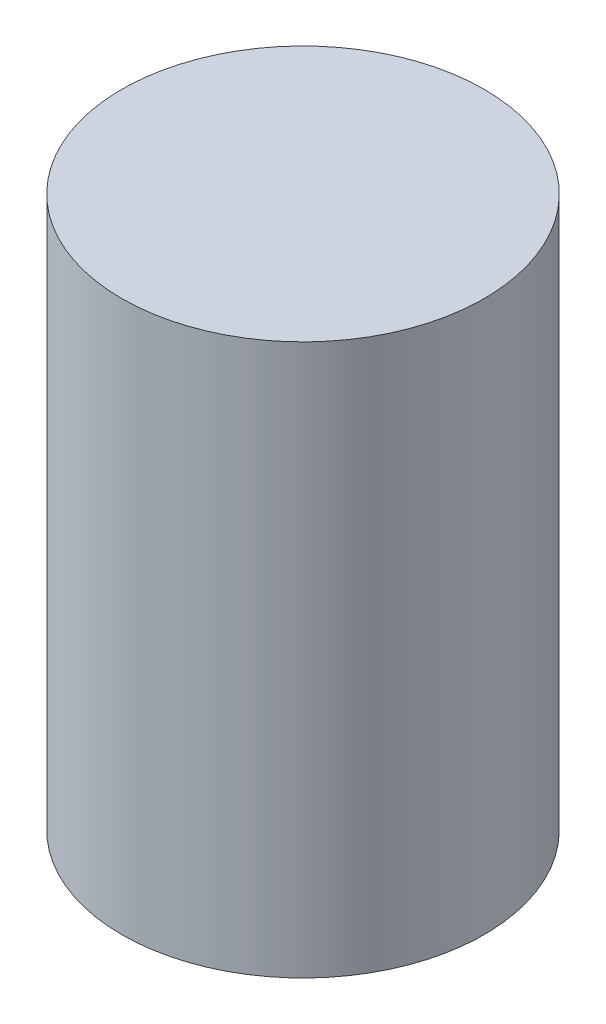
ISO-10303-21;
HEADER;
FILE_DESCRIPTION(('STEP AP214'),'2;1');
FILE_NAME('part.step','',(''),(''),'','','');
FILE_SCHEMA(('AUTOMOTIVE_DESIGN { 1 0 10303 214 1 1 1 1 }'));
ENDSEC;
DATA;
#1=APPLICATION_CONTEXT('core data for automotive mechanical design processes');
#2=APPLICATION_PROTOCOL_DEFINITION('international standard','automotive_design',2000,#1);
#3=PRODUCT_CONTEXT('',#1,'mechanical');
#4=PRODUCT('Part','Part','',(#3));
#5=PRODUCT_RELATED_PRODUCT_CATEGORY('part','',(#4));
#6=PRODUCT_DEFINITION_FORMATION('','',#4);
#7=PRODUCT_DEFINITION_CONTEXT('part definition',#1,'design');
#8=PRODUCT_DEFINITION('design','',#6,#7);
#9=PRODUCT_DEFINITION_SHAPE('','',#8);
#10=(LENGTH_UNIT() NAMED_UNIT(*) SI_UNIT(.MILLI.,.METRE.));
#11=(NAMED_UNIT(*) PLANE_ANGLE_UNIT() SI_UNIT($,.RADIAN.));
#12=(NAMED_UNIT(*) SI_UNIT($,.STERADIAN.) SOLID_ANGLE_UNIT());
#13=UNCERTAINTY_MEASURE_WITH_UNIT(LENGTH_MEASURE(1.E-05),#10,'distance_accuracy_value','');
#14=(GEOMETRIC_REPRESENTATION_CONTEXT(3) GLOBAL_UNCERTAINTY_ASSIGNED_CONTEXT((#13)) GLOBAL_UNIT_ASSIGNED_CONTEXT((#10,
#11,#12)) REPRESENTATION_CONTEXT('',''));
#15=CARTESIAN_POINT('',(0.,0.,0.));
#16=DIRECTION('',(0.,0.,1.));
#17=DIRECTION('',(1.,0.,0.));
#18=AXIS2_PLACEMENT_3D('',#15,#16,#17);
#19=CARTESIAN_POINT('',(0.,231.648,0.));
#20=DIRECTION('',(0.,-1.,0.));
#21=DIRECTION('',(0.,0.,-1.));
#22=AXIS2_PLACEMENT_3D('',#19,#20,#21);
#23=CYLINDRICAL_SURFACE('',#22,76.2);
#24=CARTESIAN_POINT('',(0.,231.648,0.));
#25=DIRECTION('',(0.,1.,0.));
#26=DIRECTION('',(0.,0.,1.));
#27=AXIS2_PLACEMENT_3D('',#24,#25,#26);
#28=CIRCLE('',#27,76.2);
#29=CARTESIAN_POINT('',(0.,231.648,76.2));
#30=VERTEX_POINT('',#29);
#31=EDGE_CURVE('E10',#30,#30,#28,.T.);
#32=ORIENTED_EDGE('',*,*,#31,.F.);
#33=EDGE_LOOP('',(#32));
#34=FACE_BOUND('',#33,.T.);
#35=CARTESIAN_POINT('',(0.,0.,0.));
#36=DIRECTION('',(0.,1.,0.));
#37=DIRECTION('',(0.,0.,1.));
#38=AXIS2_PLACEMENT_3D('',#35,#36,#37);
#39=CIRCLE('',#38,76.2);
#40=CARTESIAN_POINT('',(0.,0.,76.2));
#41=VERTEX_POINT('',#40);
#42=EDGE_CURVE('E34',#41,#41,#39,.T.);
#43=ORIENTED_EDGE('',*,*,#42,.T.);
#44=EDGE_LOOP('',(#43));
#45=FACE_BOUND('',#44,.T.);
#46=ADVANCED_FACE('F31',(#34,#45),#23,.T.);
#47=CARTESIAN_POINT('',(0.,231.648,0.));
#48=DIRECTION('',(0.,1.,0.));
#49=DIRECTION('',(0.,0.,1.));
#50=AXIS2_PLACEMENT_3D('',#47,#48,#49);
#51=PLANE('',#50);
#52=ORIENTED_EDGE('',*,*,#31,.T.);
#53=EDGE_LOOP('',(#52));
#54=FACE_BOUND('',#53,.T.);
#55=ADVANCED_FACE('F46',(#54),#51,.T.);
#56=CARTESIAN_POINT('',(0.,0.,0.));
#57=DIRECTION('',(0.,1.,0.));
#58=DIRECTION('',(0.,0.,1.));
#59=AXIS2_PLACEMENT_3D('',#56,#57,#58);
#60=PLANE('',#59);
#61=ORIENTED_EDGE('',*,*,#42,.F.);
#62=EDGE_LOOP('',(#61));
#63=FACE_BOUND('',#62,.T.);
#64=ADVANCED_FACE('F44',(#63),#60,.F.);
#65=CLOSED_SHELL('',(#46,#55,#64));
#66=MANIFOLD_SOLID_BREP('B2',#65);
#67=ADVANCED_BREP_SHAPE_REPRESENTATION('',(#18,#66),#14);
#68=SHAPE_DEFINITION_REPRESENTATION(#9,#67);
ENDSEC;
END-ISO-10303-21;
